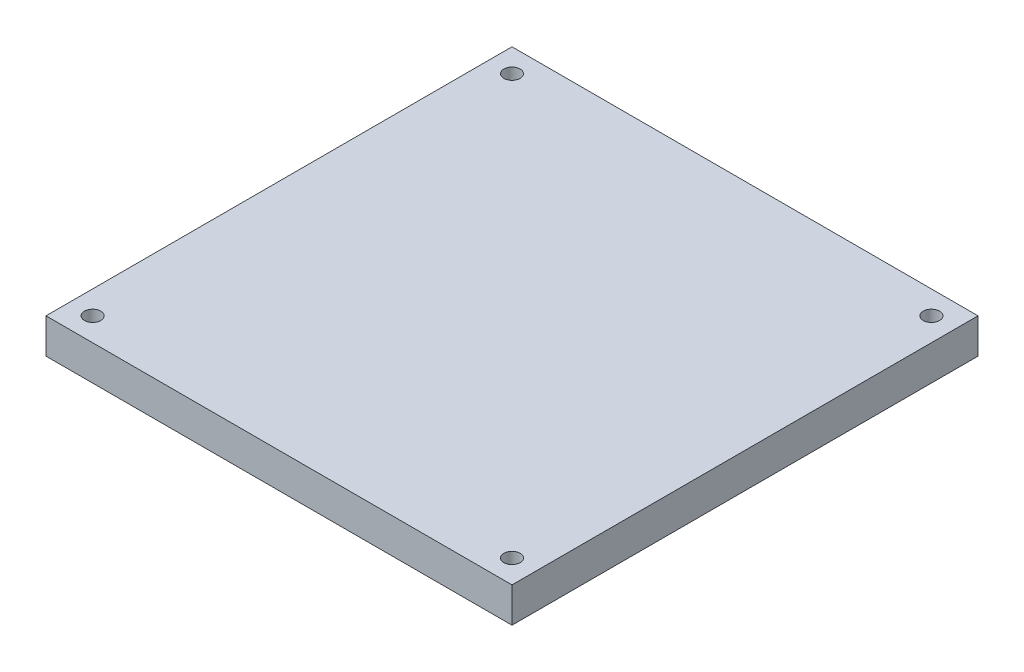
ISO-10303-21;
HEADER;
FILE_DESCRIPTION(('STEP AP214'),'2;1');
FILE_NAME('part.step','',(''),(''),'','','');
FILE_SCHEMA(('AUTOMOTIVE_DESIGN { 1 0 10303 214 1 1 1 1 }'));
ENDSEC;
DATA;
#1=APPLICATION_CONTEXT('core data for automotive mechanical design processes');
#2=APPLICATION_PROTOCOL_DEFINITION('international standard','automotive_design',2000,#1);
#3=PRODUCT_CONTEXT('',#1,'mechanical');
#4=PRODUCT('Part','Part','',(#3));
#5=PRODUCT_RELATED_PRODUCT_CATEGORY('part','',(#4));
#6=PRODUCT_DEFINITION_FORMATION('','',#4);
#7=PRODUCT_DEFINITION_CONTEXT('part definition',#1,'design');
#8=PRODUCT_DEFINITION('design','',#6,#7);
#9=PRODUCT_DEFINITION_SHAPE('','',#8);
#10=(LENGTH_UNIT() NAMED_UNIT(*) SI_UNIT(.MILLI.,.METRE.));
#11=(NAMED_UNIT(*) PLANE_ANGLE_UNIT() SI_UNIT($,.RADIAN.));
#12=(NAMED_UNIT(*) SI_UNIT($,.STERADIAN.) SOLID_ANGLE_UNIT());
#13=UNCERTAINTY_MEASURE_WITH_UNIT(LENGTH_MEASURE(1.E-05),#10,'distance_accuracy_value','');
#14=(GEOMETRIC_REPRESENTATION_CONTEXT(3) GLOBAL_UNCERTAINTY_ASSIGNED_CONTEXT((#13)) GLOBAL_UNIT_ASSIGNED_CONTEXT((#10,
#11,#12)) REPRESENTATION_CONTEXT('',''));
#15=CARTESIAN_POINT('',(0.,0.,0.));
#16=DIRECTION('',(0.,0.,1.));
#17=DIRECTION('',(1.,0.,0.));
#18=AXIS2_PLACEMENT_3D('',#15,#16,#17);
#19=CARTESIAN_POINT('',(100.,15.,100.));
#20=DIRECTION('',(-1.,0.,0.));
#21=DIRECTION('',(0.,0.,1.));
#22=AXIS2_PLACEMENT_3D('',#19,#20,#21);
#23=PLANE('',#22);
#24=DIRECTION('',(0.,0.,-1.));
#25=VECTOR('',#24,1.);
#26=CARTESIAN_POINT('',(100.,0.,100.));
#27=LINE('',#26,#25);
#28=CARTESIAN_POINT('',(100.,0.,100.));
#29=VERTEX_POINT('',#28);
#30=CARTESIAN_POINT('',(100.,0.,-100.));
#31=VERTEX_POINT('',#30);
#32=EDGE_CURVE('E97',#29,#31,#27,.T.);
#33=ORIENTED_EDGE('',*,*,#32,.T.);
#34=DIRECTION('',(0.,-1.,0.));
#35=VECTOR('',#34,1.);
#36=CARTESIAN_POINT('',(100.,15.,-100.));
#37=LINE('',#36,#35);
#38=CARTESIAN_POINT('',(100.,15.,-100.));
#39=VERTEX_POINT('',#38);
#40=EDGE_CURVE('E11',#39,#31,#37,.T.);
#41=ORIENTED_EDGE('',*,*,#40,.F.);
#42=DIRECTION('',(0.,0.,-1.));
#43=VECTOR('',#42,1.);
#44=CARTESIAN_POINT('',(100.,15.,100.));
#45=LINE('',#44,#43);
#46=CARTESIAN_POINT('',(100.,15.,100.));
#47=VERTEX_POINT('',#46);
#48=EDGE_CURVE('E85',#47,#39,#45,.T.);
#49=ORIENTED_EDGE('',*,*,#48,.F.);
#50=DIRECTION('',(0.,-1.,0.));
#51=VECTOR('',#50,1.);
#52=CARTESIAN_POINT('',(100.,15.,100.));
#53=LINE('',#52,#51);
#54=EDGE_CURVE('E93',#47,#29,#53,.T.);
#55=ORIENTED_EDGE('',*,*,#54,.T.);
#56=EDGE_LOOP('',(#33,#41,#49,#55));
#57=FACE_BOUND('',#56,.T.);
#58=ADVANCED_FACE('F34',(#57),#23,.F.);
#59=CARTESIAN_POINT('',(-100.,15.,-100.));
#60=DIRECTION('',(0.,0.,1.));
#61=DIRECTION('',(1.,0.,0.));
#62=AXIS2_PLACEMENT_3D('',#59,#60,#61);
#63=PLANE('',#62);
#64=DIRECTION('',(-1.,0.,0.));
#65=VECTOR('',#64,1.);
#66=CARTESIAN_POINT('',(-100.,0.,-100.));
#67=LINE('',#66,#65);
#68=CARTESIAN_POINT('',(-100.,0.,-100.));
#69=VERTEX_POINT('',#68);
#70=EDGE_CURVE('E89',#31,#69,#67,.T.);
#71=ORIENTED_EDGE('',*,*,#70,.T.);
#72=DIRECTION('',(0.,-1.,0.));
#73=VECTOR('',#72,1.);
#74=CARTESIAN_POINT('',(-100.,15.,-100.));
#75=LINE('',#74,#73);
#76=CARTESIAN_POINT('',(-100.,15.,-100.));
#77=VERTEX_POINT('',#76);
#78=EDGE_CURVE('E42',#77,#69,#75,.T.);
#79=ORIENTED_EDGE('',*,*,#78,.F.);
#80=DIRECTION('',(-1.,0.,0.));
#81=VECTOR('',#80,1.);
#82=CARTESIAN_POINT('',(-100.,15.,-100.));
#83=LINE('',#82,#81);
#84=EDGE_CURVE('E80',#39,#77,#83,.T.);
#85=ORIENTED_EDGE('',*,*,#84,.F.);
#86=ORIENTED_EDGE('',*,*,#40,.T.);
#87=EDGE_LOOP('',(#71,#79,#85,#86));
#88=FACE_BOUND('',#87,.T.);
#89=ADVANCED_FACE('F88',(#88),#63,.F.);
#90=CARTESIAN_POINT('',(-100.,15.,100.));
#91=DIRECTION('',(1.,0.,0.));
#92=DIRECTION('',(0.,0.,-1.));
#93=AXIS2_PLACEMENT_3D('',#90,#91,#92);
#94=PLANE('',#93);
#95=DIRECTION('',(0.,0.,1.));
#96=VECTOR('',#95,1.);
#97=CARTESIAN_POINT('',(-100.,0.,100.));
#98=LINE('',#97,#96);
#99=CARTESIAN_POINT('',(-100.,0.,100.));
#100=VERTEX_POINT('',#99);
#101=EDGE_CURVE('E67',#69,#100,#98,.T.);
#102=ORIENTED_EDGE('',*,*,#101,.T.);
#103=DIRECTION('',(0.,-1.,0.));
#104=VECTOR('',#103,1.);
#105=CARTESIAN_POINT('',(-100.,15.,100.));
#106=LINE('',#105,#104);
#107=CARTESIAN_POINT('',(-100.,15.,100.));
#108=VERTEX_POINT('',#107);
#109=EDGE_CURVE('E90',#108,#100,#106,.T.);
#110=ORIENTED_EDGE('',*,*,#109,.F.);
#111=DIRECTION('',(0.,0.,1.));
#112=VECTOR('',#111,1.);
#113=CARTESIAN_POINT('',(-100.,15.,100.));
#114=LINE('',#113,#112);
#115=EDGE_CURVE('E83',#77,#108,#114,.T.);
#116=ORIENTED_EDGE('',*,*,#115,.F.);
#117=ORIENTED_EDGE('',*,*,#78,.T.);
#118=EDGE_LOOP('',(#102,#110,#116,#117));
#119=FACE_BOUND('',#118,.T.);
#120=ADVANCED_FACE('F91',(#119),#94,.F.);
#121=CARTESIAN_POINT('',(-100.,15.,100.));
#122=DIRECTION('',(0.,0.,-1.));
#123=DIRECTION('',(-1.,0.,0.));
#124=AXIS2_PLACEMENT_3D('',#121,#122,#123);
#125=PLANE('',#124);
#126=DIRECTION('',(1.,0.,0.));
#127=VECTOR('',#126,1.);
#128=CARTESIAN_POINT('',(-100.,0.,100.));
#129=LINE('',#128,#127);
#130=EDGE_CURVE('E73',#100,#29,#129,.T.);
#131=ORIENTED_EDGE('',*,*,#130,.T.);
#132=ORIENTED_EDGE('',*,*,#54,.F.);
#133=DIRECTION('',(1.,0.,0.));
#134=VECTOR('',#133,1.);
#135=CARTESIAN_POINT('',(-100.,15.,100.));
#136=LINE('',#135,#134);
#137=EDGE_CURVE('E50',#108,#47,#136,.T.);
#138=ORIENTED_EDGE('',*,*,#137,.F.);
#139=ORIENTED_EDGE('',*,*,#109,.T.);
#140=EDGE_LOOP('',(#131,#132,#138,#139));
#141=FACE_BOUND('',#140,.T.);
#142=ADVANCED_FACE('F105',(#141),#125,.F.);
#143=CARTESIAN_POINT('',(0.,15.,0.));
#144=DIRECTION('',(0.,-1.,0.));
#145=DIRECTION('',(0.,0.,-1.));
#146=AXIS2_PLACEMENT_3D('',#143,#144,#145);
#147=PLANE('',#146);
#148=CARTESIAN_POINT('',(-90.,15.,-90.));
#149=DIRECTION('',(0.,-1.,0.));
#150=DIRECTION('',(0.,0.,-1.));
#151=AXIS2_PLACEMENT_3D('',#148,#149,#150);
#152=CIRCLE('',#151,3.49999999999999);
#153=CARTESIAN_POINT('',(-90.,15.,-93.5));
#154=VERTEX_POINT('',#153);
#155=EDGE_CURVE('E128',#154,#154,#152,.T.);
#156=ORIENTED_EDGE('',*,*,#155,.T.);
#157=EDGE_LOOP('',(#156));
#158=FACE_BOUND('',#157,.T.);
#159=CARTESIAN_POINT('',(-90.,15.,90.));
#160=DIRECTION('',(0.,-1.,0.));
#161=DIRECTION('',(0.,0.,-1.));
#162=AXIS2_PLACEMENT_3D('',#159,#160,#161);
#163=CIRCLE('',#162,3.5);
#164=CARTESIAN_POINT('',(-90.,15.,86.5));
#165=VERTEX_POINT('',#164);
#166=EDGE_CURVE('E122',#165,#165,#163,.T.);
#167=ORIENTED_EDGE('',*,*,#166,.T.);
#168=EDGE_LOOP('',(#167));
#169=FACE_BOUND('',#168,.T.);
#170=CARTESIAN_POINT('',(90.,15.,90.));
#171=DIRECTION('',(0.,-1.,0.));
#172=DIRECTION('',(0.,0.,-1.));
#173=AXIS2_PLACEMENT_3D('',#170,#171,#172);
#174=CIRCLE('',#173,3.5);
#175=CARTESIAN_POINT('',(90.,15.,86.5));
#176=VERTEX_POINT('',#175);
#177=EDGE_CURVE('E116',#176,#176,#174,.T.);
#178=ORIENTED_EDGE('',*,*,#177,.T.);
#179=EDGE_LOOP('',(#178));
#180=FACE_BOUND('',#179,.T.);
#181=CARTESIAN_POINT('',(90.,15.,-90.));
#182=DIRECTION('',(0.,-1.,0.));
#183=DIRECTION('',(0.,0.,-1.));
#184=AXIS2_PLACEMENT_3D('',#181,#182,#183);
#185=CIRCLE('',#184,3.5);
#186=CARTESIAN_POINT('',(90.,15.,-93.5));
#187=VERTEX_POINT('',#186);
#188=EDGE_CURVE('E100',#187,#187,#185,.T.);
#189=ORIENTED_EDGE('',*,*,#188,.T.);
#190=EDGE_LOOP('',(#189));
#191=FACE_BOUND('',#190,.T.);
#192=ORIENTED_EDGE('',*,*,#48,.T.);
#193=ORIENTED_EDGE('',*,*,#84,.T.);
#194=ORIENTED_EDGE('',*,*,#115,.T.);
#195=ORIENTED_EDGE('',*,*,#137,.T.);
#196=EDGE_LOOP('',(#192,#193,#194,#195));
#197=FACE_BOUND('',#196,.T.);
#198=ADVANCED_FACE('F81',(#158,#169,#180,#191,#197),#147,.F.);
#199=CARTESIAN_POINT('',(0.,0.,0.));
#200=DIRECTION('',(0.,-1.,0.));
#201=DIRECTION('',(0.,0.,-1.));
#202=AXIS2_PLACEMENT_3D('',#199,#200,#201);
#203=PLANE('',#202);
#204=CARTESIAN_POINT('',(-90.,0.,-90.));
#205=DIRECTION('',(0.,-1.,0.));
#206=DIRECTION('',(0.,0.,-1.));
#207=AXIS2_PLACEMENT_3D('',#204,#205,#206);
#208=CIRCLE('',#207,3.49999999999999);
#209=CARTESIAN_POINT('',(-90.,0.,-93.5));
#210=VERTEX_POINT('',#209);
#211=EDGE_CURVE('E131',#210,#210,#208,.T.);
#212=ORIENTED_EDGE('',*,*,#211,.F.);
#213=EDGE_LOOP('',(#212));
#214=FACE_BOUND('',#213,.T.);
#215=CARTESIAN_POINT('',(-90.,0.,90.));
#216=DIRECTION('',(0.,-1.,0.));
#217=DIRECTION('',(0.,0.,-1.));
#218=AXIS2_PLACEMENT_3D('',#215,#216,#217);
#219=CIRCLE('',#218,3.49999999999999);
#220=CARTESIAN_POINT('',(-90.,0.,86.5));
#221=VERTEX_POINT('',#220);
#222=EDGE_CURVE('E125',#221,#221,#219,.T.);
#223=ORIENTED_EDGE('',*,*,#222,.F.);
#224=EDGE_LOOP('',(#223));
#225=FACE_BOUND('',#224,.T.);
#226=CARTESIAN_POINT('',(90.,0.,90.));
#227=DIRECTION('',(0.,-1.,0.));
#228=DIRECTION('',(0.,0.,-1.));
#229=AXIS2_PLACEMENT_3D('',#226,#227,#228);
#230=CIRCLE('',#229,3.49999999999999);
#231=CARTESIAN_POINT('',(90.,0.,86.5));
#232=VERTEX_POINT('',#231);
#233=EDGE_CURVE('E119',#232,#232,#230,.T.);
#234=ORIENTED_EDGE('',*,*,#233,.F.);
#235=EDGE_LOOP('',(#234));
#236=FACE_BOUND('',#235,.T.);
#237=CARTESIAN_POINT('',(90.,0.,-90.));
#238=DIRECTION('',(0.,-1.,0.));
#239=DIRECTION('',(0.,0.,-1.));
#240=AXIS2_PLACEMENT_3D('',#237,#238,#239);
#241=CIRCLE('',#240,3.49999999999999);
#242=CARTESIAN_POINT('',(90.,0.,-93.5));
#243=VERTEX_POINT('',#242);
#244=EDGE_CURVE('E113',#243,#243,#241,.T.);
#245=ORIENTED_EDGE('',*,*,#244,.F.);
#246=EDGE_LOOP('',(#245));
#247=FACE_BOUND('',#246,.T.);
#248=ORIENTED_EDGE('',*,*,#32,.F.);
#249=ORIENTED_EDGE('',*,*,#130,.F.);
#250=ORIENTED_EDGE('',*,*,#101,.F.);
#251=ORIENTED_EDGE('',*,*,#70,.F.);
#252=EDGE_LOOP('',(#248,#249,#250,#251));
#253=FACE_BOUND('',#252,.T.);
#254=ADVANCED_FACE('F108',(#214,#225,#236,#247,#253),#203,.T.);
#255=CARTESIAN_POINT('',(90.,0.,-90.));
#256=DIRECTION('',(0.,-1.,0.));
#257=DIRECTION('',(0.,0.,-1.));
#258=AXIS2_PLACEMENT_3D('',#255,#256,#257);
#259=CYLINDRICAL_SURFACE('',#258,3.5);
#260=ORIENTED_EDGE('',*,*,#188,.F.);
#261=EDGE_LOOP('',(#260));
#262=FACE_BOUND('',#261,.T.);
#263=ORIENTED_EDGE('',*,*,#244,.T.);
#264=EDGE_LOOP('',(#263));
#265=FACE_BOUND('',#264,.T.);
#266=ADVANCED_FACE('F139',(#262,#265),#259,.F.);
#267=CARTESIAN_POINT('',(90.,0.,90.));
#268=DIRECTION('',(0.,-1.,0.));
#269=DIRECTION('',(0.,0.,-1.));
#270=AXIS2_PLACEMENT_3D('',#267,#268,#269);
#271=CYLINDRICAL_SURFACE('',#270,3.5);
#272=ORIENTED_EDGE('',*,*,#177,.F.);
#273=EDGE_LOOP('',(#272));
#274=FACE_BOUND('',#273,.T.);
#275=ORIENTED_EDGE('',*,*,#233,.T.);
#276=EDGE_LOOP('',(#275));
#277=FACE_BOUND('',#276,.T.);
#278=ADVANCED_FACE('F148',(#274,#277),#271,.F.);
#279=CARTESIAN_POINT('',(-90.,0.,90.));
#280=DIRECTION('',(0.,-1.,0.));
#281=DIRECTION('',(0.,0.,-1.));
#282=AXIS2_PLACEMENT_3D('',#279,#280,#281);
#283=CYLINDRICAL_SURFACE('',#282,3.5);
#284=ORIENTED_EDGE('',*,*,#166,.F.);
#285=EDGE_LOOP('',(#284));
#286=FACE_BOUND('',#285,.T.);
#287=ORIENTED_EDGE('',*,*,#222,.T.);
#288=EDGE_LOOP('',(#287));
#289=FACE_BOUND('',#288,.T.);
#290=ADVANCED_FACE('F154',(#286,#289),#283,.F.);
#291=CARTESIAN_POINT('',(-90.,0.,-90.));
#292=DIRECTION('',(0.,-1.,0.));
#293=DIRECTION('',(0.,0.,-1.));
#294=AXIS2_PLACEMENT_3D('',#291,#292,#293);
#295=CYLINDRICAL_SURFACE('',#294,3.49999999999999);
#296=ORIENTED_EDGE('',*,*,#155,.F.);
#297=EDGE_LOOP('',(#296));
#298=FACE_BOUND('',#297,.T.);
#299=ORIENTED_EDGE('',*,*,#211,.T.);
#300=EDGE_LOOP('',(#299));
#301=FACE_BOUND('',#300,.T.);
#302=ADVANCED_FACE('F135',(#298,#301),#295,.F.);
#303=CLOSED_SHELL('',(#58,#89,#120,#142,#198,#254,#266,#278,#290,#302));
#304=MANIFOLD_SOLID_BREP('B2',#303);
#305=ADVANCED_BREP_SHAPE_REPRESENTATION('',(#18,#304),#14);
#306=SHAPE_DEFINITION_REPRESENTATION(#9,#305);
ENDSEC;
END-ISO-10303-21;
